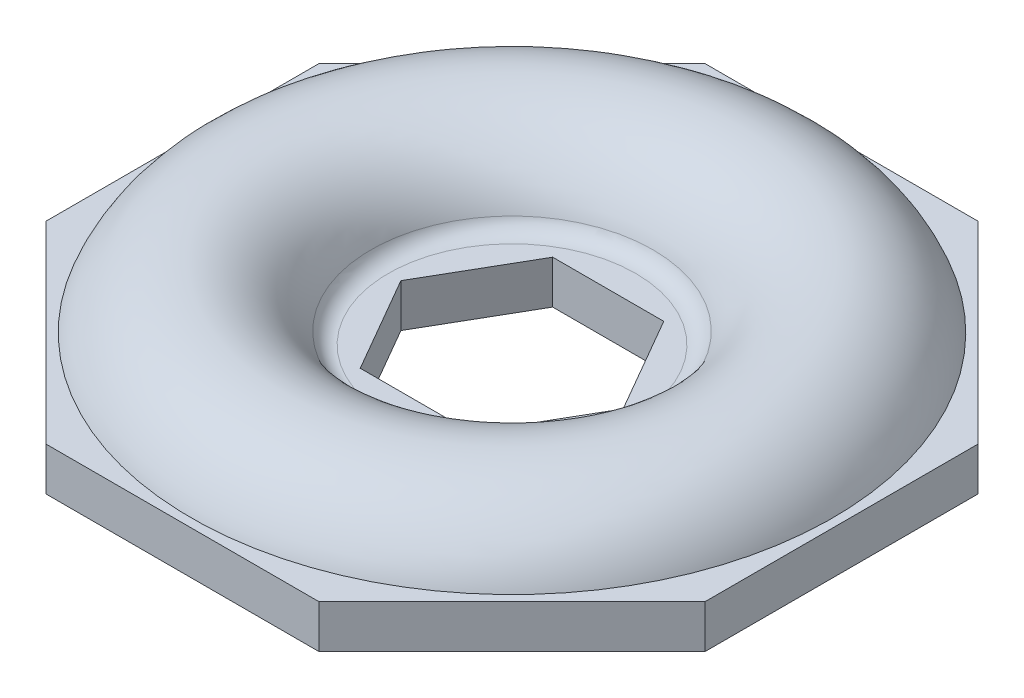
ISO-10303-21;
HEADER;
FILE_DESCRIPTION(('STEP AP214'),'2;1');
FILE_NAME('part.step','',(''),(''),'','','');
FILE_SCHEMA(('AUTOMOTIVE_DESIGN { 1 0 10303 214 1 1 1 1 }'));
ENDSEC;
DATA;
#1=APPLICATION_CONTEXT('core data for automotive mechanical design processes');
#2=APPLICATION_PROTOCOL_DEFINITION('international standard','automotive_design',2000,#1);
#3=PRODUCT_CONTEXT('',#1,'mechanical');
#4=PRODUCT('Part','Part','',(#3));
#5=PRODUCT_RELATED_PRODUCT_CATEGORY('part','',(#4));
#6=PRODUCT_DEFINITION_FORMATION('','',#4);
#7=PRODUCT_DEFINITION_CONTEXT('part definition',#1,'design');
#8=PRODUCT_DEFINITION('design','',#6,#7);
#9=PRODUCT_DEFINITION_SHAPE('','',#8);
#10=(LENGTH_UNIT() NAMED_UNIT(*) SI_UNIT(.MILLI.,.METRE.));
#11=(NAMED_UNIT(*) PLANE_ANGLE_UNIT() SI_UNIT($,.RADIAN.));
#12=(NAMED_UNIT(*) SI_UNIT($,.STERADIAN.) SOLID_ANGLE_UNIT());
#13=UNCERTAINTY_MEASURE_WITH_UNIT(LENGTH_MEASURE(1.E-05),#10,'distance_accuracy_value','');
#14=(GEOMETRIC_REPRESENTATION_CONTEXT(3) GLOBAL_UNCERTAINTY_ASSIGNED_CONTEXT((#13)) GLOBAL_UNIT_ASSIGNED_CONTEXT((#10,
#11,#12)) REPRESENTATION_CONTEXT('',''));
#15=CARTESIAN_POINT('',(0.,0.,0.));
#16=DIRECTION('',(0.,0.,1.));
#17=DIRECTION('',(1.,0.,0.));
#18=AXIS2_PLACEMENT_3D('',#15,#16,#17);
#19=CARTESIAN_POINT('',(-15.0178274382566,0.508000000000002,0.));
#20=DIRECTION('',(0.,1.,0.));
#21=DIRECTION('',(0.,0.,1.));
#22=AXIS2_PLACEMENT_3D('',#19,#20,#21);
#23=PLANE('',#22);
#24=CARTESIAN_POINT('',(0.,0.508000000000008,0.));
#25=DIRECTION('',(0.,-1.,0.));
#26=DIRECTION('',(0.,0.,-1.));
#27=AXIS2_PLACEMENT_3D('',#24,#25,#26);
#28=CIRCLE('',#27,15.0178274382566);
#29=CARTESIAN_POINT('',(0.,0.508000000000008,-15.0178274382566));
#30=VERTEX_POINT('',#29);
#31=EDGE_CURVE('E245',#30,#30,#28,.T.);
#32=ORIENTED_EDGE('',*,*,#31,.F.);
#33=EDGE_LOOP('',(#32));
#34=FACE_BOUND('',#33,.T.);
#35=DIRECTION('',(-1.,0.,0.));
#36=VECTOR('',#35,1.);
#37=CARTESIAN_POINT('',(-6.57564030267289,0.508000000000002,15.875));
#38=LINE('',#37,#36);
#39=CARTESIAN_POINT('',(6.57564030267288,0.508000000000002,15.875));
#40=VERTEX_POINT('',#39);
#41=CARTESIAN_POINT('',(-6.57564030267289,0.508000000000002,15.875));
#42=VERTEX_POINT('',#41);
#43=EDGE_CURVE('E189',#40,#42,#38,.T.);
#44=ORIENTED_EDGE('',*,*,#43,.T.);
#45=DIRECTION('',(-0.707106781186547,0.,-0.707106781186548));
#46=VECTOR('',#45,1.);
#47=CARTESIAN_POINT('',(-15.875,0.508000000000002,6.57564030267288));
#48=LINE('',#47,#46);
#49=CARTESIAN_POINT('',(-15.875,0.508000000000002,6.57564030267288));
#50=VERTEX_POINT('',#49);
#51=EDGE_CURVE('E186',#42,#50,#48,.T.);
#52=ORIENTED_EDGE('',*,*,#51,.T.);
#53=DIRECTION('',(0.,0.,-1.));
#54=VECTOR('',#53,1.);
#55=CARTESIAN_POINT('',(-15.875,0.508000000000002,-6.57564030267289));
#56=LINE('',#55,#54);
#57=CARTESIAN_POINT('',(-15.875,0.508000000000002,-6.57564030267289));
#58=VERTEX_POINT('',#57);
#59=EDGE_CURVE('E183',#50,#58,#56,.T.);
#60=ORIENTED_EDGE('',*,*,#59,.T.);
#61=DIRECTION('',(0.707106781186548,0.,-0.707106781186548));
#62=VECTOR('',#61,1.);
#63=CARTESIAN_POINT('',(-6.57564030267289,0.508000000000002,-15.875));
#64=LINE('',#63,#62);
#65=CARTESIAN_POINT('',(-6.57564030267289,0.508000000000002,-15.875));
#66=VERTEX_POINT('',#65);
#67=EDGE_CURVE('E180',#58,#66,#64,.T.);
#68=ORIENTED_EDGE('',*,*,#67,.T.);
#69=DIRECTION('',(1.,0.,0.));
#70=VECTOR('',#69,1.);
#71=CARTESIAN_POINT('',(6.57564030267287,0.508000000000002,-15.875));
#72=LINE('',#71,#70);
#73=CARTESIAN_POINT('',(6.57564030267287,0.508000000000002,-15.875));
#74=VERTEX_POINT('',#73);
#75=EDGE_CURVE('E177',#66,#74,#72,.T.);
#76=ORIENTED_EDGE('',*,*,#75,.T.);
#77=DIRECTION('',(0.707106781186548,0.,0.707106781186547));
#78=VECTOR('',#77,1.);
#79=CARTESIAN_POINT('',(15.875,0.508000000000002,-6.5756403026729));
#80=LINE('',#79,#78);
#81=CARTESIAN_POINT('',(15.875,0.508000000000002,-6.5756403026729));
#82=VERTEX_POINT('',#81);
#83=EDGE_CURVE('E174',#74,#82,#80,.T.);
#84=ORIENTED_EDGE('',*,*,#83,.T.);
#85=DIRECTION('',(0.,0.,1.));
#86=VECTOR('',#85,1.);
#87=CARTESIAN_POINT('',(15.875,0.508000000000002,6.57564030267288));
#88=LINE('',#87,#86);
#89=CARTESIAN_POINT('',(15.875,0.508000000000002,6.57564030267288));
#90=VERTEX_POINT('',#89);
#91=EDGE_CURVE('E171',#82,#90,#88,.T.);
#92=ORIENTED_EDGE('',*,*,#91,.T.);
#93=DIRECTION('',(-0.707106781186547,0.,0.707106781186548));
#94=VECTOR('',#93,1.);
#95=CARTESIAN_POINT('',(6.57564030267288,0.508000000000002,15.875));
#96=LINE('',#95,#94);
#97=EDGE_CURVE('E219',#90,#40,#96,.T.);
#98=ORIENTED_EDGE('',*,*,#97,.T.);
#99=EDGE_LOOP('',(#44,#52,#60,#68,#76,#84,#92,#98));
#100=FACE_BOUND('',#99,.T.);
#101=ADVANCED_FACE('F16',(#34,#100),#23,.F.);
#102=CARTESIAN_POINT('',(0.,0.,0.));
#103=DIRECTION('',(0.,1.,0.));
#104=DIRECTION('',(0.,0.,1.));
#105=AXIS2_PLACEMENT_3D('',#102,#103,#104);
#106=PLANE('',#105);
#107=DIRECTION('',(0.5,0.,0.866025403784439));
#108=VECTOR('',#107,1.);
#109=CARTESIAN_POINT('',(-4.01446075924276,0.,2.31775));
#110=LINE('',#109,#108);
#111=CARTESIAN_POINT('',(-5.35261434565702,0.,0.));
#112=VERTEX_POINT('',#111);
#113=CARTESIAN_POINT('',(-2.67630717282851,0.,4.6355));
#114=VERTEX_POINT('',#113);
#115=EDGE_CURVE('E165',#112,#114,#110,.T.);
#116=ORIENTED_EDGE('',*,*,#115,.T.);
#117=DIRECTION('',(1.,0.,0.));
#118=VECTOR('',#117,1.);
#119=CARTESIAN_POINT('',(0.,0.,4.6355));
#120=LINE('',#119,#118);
#121=CARTESIAN_POINT('',(2.67630717282851,0.,4.6355));
#122=VERTEX_POINT('',#121);
#123=EDGE_CURVE('E168',#114,#122,#120,.T.);
#124=ORIENTED_EDGE('',*,*,#123,.T.);
#125=DIRECTION('',(0.5,0.,-0.866025403784439));
#126=VECTOR('',#125,1.);
#127=CARTESIAN_POINT('',(4.01446075924276,0.,2.31775));
#128=LINE('',#127,#126);
#129=CARTESIAN_POINT('',(5.35261434565702,0.,0.));
#130=VERTEX_POINT('',#129);
#131=EDGE_CURVE('E150',#122,#130,#128,.T.);
#132=ORIENTED_EDGE('',*,*,#131,.T.);
#133=DIRECTION('',(-0.5,0.,-0.866025403784438));
#134=VECTOR('',#133,1.);
#135=CARTESIAN_POINT('',(4.01446075924276,0.,-2.31775));
#136=LINE('',#135,#134);
#137=CARTESIAN_POINT('',(2.67630717282851,0.,-4.6355));
#138=VERTEX_POINT('',#137);
#139=EDGE_CURVE('E123',#130,#138,#136,.T.);
#140=ORIENTED_EDGE('',*,*,#139,.T.);
#141=DIRECTION('',(-1.,0.,0.));
#142=VECTOR('',#141,1.);
#143=CARTESIAN_POINT('',(0.,0.,-4.6355));
#144=LINE('',#143,#142);
#145=CARTESIAN_POINT('',(-2.67630717282851,0.,-4.6355));
#146=VERTEX_POINT('',#145);
#147=EDGE_CURVE('E159',#138,#146,#144,.T.);
#148=ORIENTED_EDGE('',*,*,#147,.T.);
#149=DIRECTION('',(-0.5,0.,0.866025403784439));
#150=VECTOR('',#149,1.);
#151=CARTESIAN_POINT('',(-4.01446075924277,0.,-2.31775));
#152=LINE('',#151,#150);
#153=EDGE_CURVE('E162',#146,#112,#152,.T.);
#154=ORIENTED_EDGE('',*,*,#153,.T.);
#155=EDGE_LOOP('',(#116,#124,#132,#140,#148,#154));
#156=FACE_BOUND('',#155,.T.);
#157=CARTESIAN_POINT('',(0.,0.,0.));
#158=DIRECTION('',(0.,-1.,0.));
#159=DIRECTION('',(0.,0.,-1.));
#160=AXIS2_PLACEMENT_3D('',#157,#158,#159);
#161=CIRCLE('',#160,5.95936642905503);
#162=CARTESIAN_POINT('',(0.,0.,-5.95936642905503));
#163=VERTEX_POINT('',#162);
#164=EDGE_CURVE('E11',#163,#163,#161,.T.);
#165=ORIENTED_EDGE('',*,*,#164,.T.);
#166=EDGE_LOOP('',(#165));
#167=FACE_BOUND('',#166,.T.);
#168=ADVANCED_FACE('F18',(#156,#167),#106,.F.);
#169=CARTESIAN_POINT('',(0.,2.9718,0.));
#170=DIRECTION('',(0.,-1.,0.));
#171=DIRECTION('',(0.,0.,-1.));
#172=AXIS2_PLACEMENT_3D('',#169,#170,#171);
#173=TOROIDAL_SURFACE('',#172,5.95936642905503,2.9718);
#174=ORIENTED_EDGE('',*,*,#164,.F.);
#175=EDGE_LOOP('',(#174));
#176=FACE_BOUND('',#175,.T.);
#177=CARTESIAN_POINT('',(0.,1.91729032258064,0.));
#178=DIRECTION('',(0.,-1.,0.));
#179=DIRECTION('',(0.,0.,-1.));
#180=AXIS2_PLACEMENT_3D('',#177,#178,#179);
#181=CIRCLE('',#180,8.73778406868896);
#182=CARTESIAN_POINT('',(0.,1.91729032258064,-8.73778406868896));
#183=VERTEX_POINT('',#182);
#184=EDGE_CURVE('E24',#183,#183,#181,.T.);
#185=ORIENTED_EDGE('',*,*,#184,.T.);
#186=EDGE_LOOP('',(#185));
#187=FACE_BOUND('',#186,.T.);
#188=ADVANCED_FACE('F253',(#176,#187),#173,.T.);
#189=CARTESIAN_POINT('',(0.,1.016,0.));
#190=DIRECTION('',(0.,-1.,0.));
#191=DIRECTION('',(0.,0.,-1.));
#192=AXIS2_PLACEMENT_3D('',#189,#190,#191);
#193=TOROIDAL_SURFACE('',#192,11.1125,2.54);
#194=ORIENTED_EDGE('',*,*,#184,.F.);
#195=EDGE_LOOP('',(#194));
#196=FACE_BOUND('',#195,.T.);
#197=CARTESIAN_POINT('',(0.,1.63297160883281,0.));
#198=DIRECTION('',(0.,-1.,0.));
#199=DIRECTION('',(0.,0.,-1.));
#200=AXIS2_PLACEMENT_3D('',#197,#198,#199);
#201=CIRCLE('',#200,13.5764289831272);
#202=CARTESIAN_POINT('',(0.,1.63297160883281,-13.5764289831272));
#203=VERTEX_POINT('',#202);
#204=EDGE_CURVE('E248',#203,#203,#201,.T.);
#205=ORIENTED_EDGE('',*,*,#204,.T.);
#206=EDGE_LOOP('',(#205));
#207=FACE_BOUND('',#206,.T.);
#208=ADVANCED_FACE('F255',(#196,#207),#193,.F.);
#209=CARTESIAN_POINT('',(0.,1.9939,0.));
#210=DIRECTION('',(0.,-1.,0.));
#211=DIRECTION('',(0.,0.,-1.));
#212=AXIS2_PLACEMENT_3D('',#209,#210,#211);
#213=TOROIDAL_SURFACE('',#212,15.0178274382566,1.4859);
#214=ORIENTED_EDGE('',*,*,#204,.F.);
#215=EDGE_LOOP('',(#214));
#216=FACE_BOUND('',#215,.T.);
#217=ORIENTED_EDGE('',*,*,#31,.T.);
#218=EDGE_LOOP('',(#217));
#219=FACE_BOUND('',#218,.T.);
#220=ADVANCED_FACE('F258',(#216,#219),#213,.T.);
#221=CARTESIAN_POINT('',(-6.57564030267289,-0.001000000000001,15.875));
#222=DIRECTION('',(0.,0.,1.));
#223=DIRECTION('',(1.,0.,0.));
#224=AXIS2_PLACEMENT_3D('',#221,#222,#223);
#225=PLANE('',#224);
#226=DIRECTION('',(0.,1.,0.));
#227=VECTOR('',#226,1.);
#228=CARTESIAN_POINT('',(6.57564030267288,-0.001000000000001,15.875));
#229=LINE('',#228,#227);
#230=CARTESIAN_POINT('',(6.57564030267288,2.5908,15.875));
#231=VERTEX_POINT('',#230);
#232=EDGE_CURVE('E216',#40,#231,#229,.T.);
#233=ORIENTED_EDGE('',*,*,#232,.T.);
#234=DIRECTION('',(1.,0.,0.));
#235=VECTOR('',#234,1.);
#236=CARTESIAN_POINT('',(-6.57564030267289,2.5908,15.875));
#237=LINE('',#236,#235);
#238=CARTESIAN_POINT('',(-6.57564030267289,2.5908,15.875));
#239=VERTEX_POINT('',#238);
#240=EDGE_CURVE('E192',#239,#231,#237,.T.);
#241=ORIENTED_EDGE('',*,*,#240,.F.);
#242=DIRECTION('',(0.,1.,0.));
#243=VECTOR('',#242,1.);
#244=CARTESIAN_POINT('',(-6.57564030267289,-0.001000000000001,15.875));
#245=LINE('',#244,#243);
#246=EDGE_CURVE('E217',#42,#239,#245,.T.);
#247=ORIENTED_EDGE('',*,*,#246,.F.);
#248=ORIENTED_EDGE('',*,*,#43,.F.);
#249=EDGE_LOOP('',(#233,#241,#247,#248));
#250=FACE_BOUND('',#249,.T.);
#251=ADVANCED_FACE('F264',(#250),#225,.T.);
#252=CARTESIAN_POINT('',(-15.875,-0.001000000000001,6.57564030267288));
#253=DIRECTION('',(-0.707106781186548,0.,0.707106781186547));
#254=DIRECTION('',(0.707106781186547,0.,0.707106781186548));
#255=AXIS2_PLACEMENT_3D('',#252,#253,#254);
#256=PLANE('',#255);
#257=ORIENTED_EDGE('',*,*,#246,.T.);
#258=DIRECTION('',(0.707106781186547,0.,0.707106781186548));
#259=VECTOR('',#258,1.);
#260=CARTESIAN_POINT('',(-15.875,2.5908,6.57564030267288));
#261=LINE('',#260,#259);
#262=CARTESIAN_POINT('',(-15.875,2.5908,6.57564030267288));
#263=VERTEX_POINT('',#262);
#264=EDGE_CURVE('E213',#263,#239,#261,.T.);
#265=ORIENTED_EDGE('',*,*,#264,.F.);
#266=DIRECTION('',(0.,1.,0.));
#267=VECTOR('',#266,1.);
#268=CARTESIAN_POINT('',(-15.875,-0.001000000000001,6.57564030267288));
#269=LINE('',#268,#267);
#270=EDGE_CURVE('E220',#50,#263,#269,.T.);
#271=ORIENTED_EDGE('',*,*,#270,.F.);
#272=ORIENTED_EDGE('',*,*,#51,.F.);
#273=EDGE_LOOP('',(#257,#265,#271,#272));
#274=FACE_BOUND('',#273,.T.);
#275=ADVANCED_FACE('F278',(#274),#256,.T.);
#276=CARTESIAN_POINT('',(-15.875,-0.001000000000001,-6.57564030267289));
#277=DIRECTION('',(-1.,0.,0.));
#278=DIRECTION('',(0.,0.,1.));
#279=AXIS2_PLACEMENT_3D('',#276,#277,#278);
#280=PLANE('',#279);
#281=ORIENTED_EDGE('',*,*,#270,.T.);
#282=DIRECTION('',(0.,0.,1.));
#283=VECTOR('',#282,1.);
#284=CARTESIAN_POINT('',(-15.875,2.5908,-6.57564030267289));
#285=LINE('',#284,#283);
#286=CARTESIAN_POINT('',(-15.875,2.5908,-6.57564030267289));
#287=VERTEX_POINT('',#286);
#288=EDGE_CURVE('E210',#287,#263,#285,.T.);
#289=ORIENTED_EDGE('',*,*,#288,.F.);
#290=DIRECTION('',(0.,1.,0.));
#291=VECTOR('',#290,1.);
#292=CARTESIAN_POINT('',(-15.875,-0.001000000000001,-6.57564030267289));
#293=LINE('',#292,#291);
#294=EDGE_CURVE('E222',#58,#287,#293,.T.);
#295=ORIENTED_EDGE('',*,*,#294,.F.);
#296=ORIENTED_EDGE('',*,*,#59,.F.);
#297=EDGE_LOOP('',(#281,#289,#295,#296));
#298=FACE_BOUND('',#297,.T.);
#299=ADVANCED_FACE('F282',(#298),#280,.T.);
#300=CARTESIAN_POINT('',(-6.57564030267289,-0.001000000000001,-15.875));
#301=DIRECTION('',(-0.707106781186548,0.,-0.707106781186548));
#302=DIRECTION('',(-0.707106781186548,0.,0.707106781186548));
#303=AXIS2_PLACEMENT_3D('',#300,#301,#302);
#304=PLANE('',#303);
#305=ORIENTED_EDGE('',*,*,#294,.T.);
#306=DIRECTION('',(-0.707106781186548,0.,0.707106781186548));
#307=VECTOR('',#306,1.);
#308=CARTESIAN_POINT('',(-6.57564030267289,2.5908,-15.875));
#309=LINE('',#308,#307);
#310=CARTESIAN_POINT('',(-6.57564030267289,2.5908,-15.875));
#311=VERTEX_POINT('',#310);
#312=EDGE_CURVE('E207',#311,#287,#309,.T.);
#313=ORIENTED_EDGE('',*,*,#312,.F.);
#314=DIRECTION('',(0.,1.,0.));
#315=VECTOR('',#314,1.);
#316=CARTESIAN_POINT('',(-6.57564030267289,-0.001000000000001,-15.875));
#317=LINE('',#316,#315);
#318=EDGE_CURVE('E224',#66,#311,#317,.T.);
#319=ORIENTED_EDGE('',*,*,#318,.F.);
#320=ORIENTED_EDGE('',*,*,#67,.F.);
#321=EDGE_LOOP('',(#305,#313,#319,#320));
#322=FACE_BOUND('',#321,.T.);
#323=ADVANCED_FACE('F286',(#322),#304,.T.);
#324=CARTESIAN_POINT('',(6.57564030267287,-0.001000000000001,-15.875));
#325=DIRECTION('',(0.,0.,-1.));
#326=DIRECTION('',(-1.,0.,0.));
#327=AXIS2_PLACEMENT_3D('',#324,#325,#326);
#328=PLANE('',#327);
#329=ORIENTED_EDGE('',*,*,#318,.T.);
#330=DIRECTION('',(-1.,0.,0.));
#331=VECTOR('',#330,1.);
#332=CARTESIAN_POINT('',(6.57564030267287,2.5908,-15.875));
#333=LINE('',#332,#331);
#334=CARTESIAN_POINT('',(6.57564030267287,2.5908,-15.875));
#335=VERTEX_POINT('',#334);
#336=EDGE_CURVE('E204',#335,#311,#333,.T.);
#337=ORIENTED_EDGE('',*,*,#336,.F.);
#338=DIRECTION('',(0.,1.,0.));
#339=VECTOR('',#338,1.);
#340=CARTESIAN_POINT('',(6.57564030267287,-0.001000000000001,-15.875));
#341=LINE('',#340,#339);
#342=EDGE_CURVE('E226',#74,#335,#341,.T.);
#343=ORIENTED_EDGE('',*,*,#342,.F.);
#344=ORIENTED_EDGE('',*,*,#75,.F.);
#345=EDGE_LOOP('',(#329,#337,#343,#344));
#346=FACE_BOUND('',#345,.T.);
#347=ADVANCED_FACE('F290',(#346),#328,.T.);
#348=CARTESIAN_POINT('',(15.875,-0.001000000000001,-6.5756403026729));
#349=DIRECTION('',(0.707106781186547,0.,-0.707106781186548));
#350=DIRECTION('',(-0.707106781186548,0.,-0.707106781186547));
#351=AXIS2_PLACEMENT_3D('',#348,#349,#350);
#352=PLANE('',#351);
#353=ORIENTED_EDGE('',*,*,#342,.T.);
#354=DIRECTION('',(-0.707106781186548,0.,-0.707106781186547));
#355=VECTOR('',#354,1.);
#356=CARTESIAN_POINT('',(15.875,2.5908,-6.5756403026729));
#357=LINE('',#356,#355);
#358=CARTESIAN_POINT('',(15.875,2.5908,-6.5756403026729));
#359=VERTEX_POINT('',#358);
#360=EDGE_CURVE('E201',#359,#335,#357,.T.);
#361=ORIENTED_EDGE('',*,*,#360,.F.);
#362=DIRECTION('',(0.,1.,0.));
#363=VECTOR('',#362,1.);
#364=CARTESIAN_POINT('',(15.875,-0.001000000000001,-6.5756403026729));
#365=LINE('',#364,#363);
#366=EDGE_CURVE('E228',#82,#359,#365,.T.);
#367=ORIENTED_EDGE('',*,*,#366,.F.);
#368=ORIENTED_EDGE('',*,*,#83,.F.);
#369=EDGE_LOOP('',(#353,#361,#367,#368));
#370=FACE_BOUND('',#369,.T.);
#371=ADVANCED_FACE('F294',(#370),#352,.T.);
#372=CARTESIAN_POINT('',(15.875,-0.001000000000001,6.57564030267288));
#373=DIRECTION('',(1.,0.,0.));
#374=DIRECTION('',(0.,0.,-1.));
#375=AXIS2_PLACEMENT_3D('',#372,#373,#374);
#376=PLANE('',#375);
#377=ORIENTED_EDGE('',*,*,#366,.T.);
#378=DIRECTION('',(0.,0.,-1.));
#379=VECTOR('',#378,1.);
#380=CARTESIAN_POINT('',(15.875,2.5908,6.57564030267288));
#381=LINE('',#380,#379);
#382=CARTESIAN_POINT('',(15.875,2.5908,6.57564030267288));
#383=VERTEX_POINT('',#382);
#384=EDGE_CURVE('E198',#383,#359,#381,.T.);
#385=ORIENTED_EDGE('',*,*,#384,.F.);
#386=DIRECTION('',(0.,1.,0.));
#387=VECTOR('',#386,1.);
#388=CARTESIAN_POINT('',(15.875,-0.001000000000001,6.57564030267288));
#389=LINE('',#388,#387);
#390=EDGE_CURVE('E230',#90,#383,#389,.T.);
#391=ORIENTED_EDGE('',*,*,#390,.F.);
#392=ORIENTED_EDGE('',*,*,#91,.F.);
#393=EDGE_LOOP('',(#377,#385,#391,#392));
#394=FACE_BOUND('',#393,.T.);
#395=ADVANCED_FACE('F298',(#394),#376,.T.);
#396=CARTESIAN_POINT('',(6.57564030267288,-0.001000000000001,15.875));
#397=DIRECTION('',(0.707106781186548,0.,0.707106781186547));
#398=DIRECTION('',(0.707106781186547,0.,-0.707106781186548));
#399=AXIS2_PLACEMENT_3D('',#396,#397,#398);
#400=PLANE('',#399);
#401=ORIENTED_EDGE('',*,*,#390,.T.);
#402=DIRECTION('',(0.707106781186547,0.,-0.707106781186548));
#403=VECTOR('',#402,1.);
#404=CARTESIAN_POINT('',(6.57564030267288,2.5908,15.875));
#405=LINE('',#404,#403);
#406=EDGE_CURVE('E195',#231,#383,#405,.T.);
#407=ORIENTED_EDGE('',*,*,#406,.F.);
#408=ORIENTED_EDGE('',*,*,#232,.F.);
#409=ORIENTED_EDGE('',*,*,#97,.F.);
#410=EDGE_LOOP('',(#401,#407,#408,#409));
#411=FACE_BOUND('',#410,.T.);
#412=ADVANCED_FACE('F300',(#411),#400,.T.);
#413=CARTESIAN_POINT('',(0.,2.0828,0.));
#414=DIRECTION('',(0.,-1.,0.));
#415=DIRECTION('',(0.,0.,-1.));
#416=AXIS2_PLACEMENT_3D('',#413,#414,#415);
#417=PLANE('',#416);
#418=DIRECTION('',(0.5,0.,-0.866025403784439));
#419=VECTOR('',#418,1.);
#420=CARTESIAN_POINT('',(2.67630717282851,2.0828,4.6355));
#421=LINE('',#420,#419);
#422=CARTESIAN_POINT('',(2.67630717282851,2.0828,4.6355));
#423=VERTEX_POINT('',#422);
#424=CARTESIAN_POINT('',(5.35261434565702,2.0828,0.));
#425=VERTEX_POINT('',#424);
#426=EDGE_CURVE('E129',#423,#425,#421,.T.);
#427=ORIENTED_EDGE('',*,*,#426,.F.);
#428=DIRECTION('',(1.,0.,0.));
#429=VECTOR('',#428,1.);
#430=CARTESIAN_POINT('',(-2.67630717282851,2.0828,4.6355));
#431=LINE('',#430,#429);
#432=CARTESIAN_POINT('',(-2.67630717282851,2.0828,4.6355));
#433=VERTEX_POINT('',#432);
#434=EDGE_CURVE('E39',#433,#423,#431,.T.);
#435=ORIENTED_EDGE('',*,*,#434,.F.);
#436=DIRECTION('',(0.5,0.,0.866025403784438));
#437=VECTOR('',#436,1.);
#438=CARTESIAN_POINT('',(-5.35261434565702,2.0828,0.));
#439=LINE('',#438,#437);
#440=CARTESIAN_POINT('',(-5.35261434565702,2.0828,0.));
#441=VERTEX_POINT('',#440);
#442=EDGE_CURVE('E145',#441,#433,#439,.T.);
#443=ORIENTED_EDGE('',*,*,#442,.F.);
#444=DIRECTION('',(-0.5,0.,0.866025403784439));
#445=VECTOR('',#444,1.);
#446=CARTESIAN_POINT('',(-2.67630717282851,2.0828,-4.6355));
#447=LINE('',#446,#445);
#448=CARTESIAN_POINT('',(-2.67630717282851,2.0828,-4.6355));
#449=VERTEX_POINT('',#448);
#450=EDGE_CURVE('E139',#449,#441,#447,.T.);
#451=ORIENTED_EDGE('',*,*,#450,.F.);
#452=DIRECTION('',(-1.,0.,0.));
#453=VECTOR('',#452,1.);
#454=CARTESIAN_POINT('',(2.67630717282851,2.0828,-4.6355));
#455=LINE('',#454,#453);
#456=CARTESIAN_POINT('',(2.67630717282851,2.0828,-4.6355));
#457=VERTEX_POINT('',#456);
#458=EDGE_CURVE('E137',#457,#449,#455,.T.);
#459=ORIENTED_EDGE('',*,*,#458,.F.);
#460=DIRECTION('',(-0.5,0.,-0.866025403784438));
#461=VECTOR('',#460,1.);
#462=CARTESIAN_POINT('',(5.35261434565702,2.0828,0.));
#463=LINE('',#462,#461);
#464=EDGE_CURVE('E120',#425,#457,#463,.T.);
#465=ORIENTED_EDGE('',*,*,#464,.F.);
#466=EDGE_LOOP('',(#427,#435,#443,#451,#459,#465));
#467=FACE_BOUND('',#466,.T.);
#468=CARTESIAN_POINT('',(0.,2.0828,0.));
#469=DIRECTION('',(0.,-1.,0.));
#470=DIRECTION('',(0.,0.,-1.));
#471=AXIS2_PLACEMENT_3D('',#468,#469,#470);
#472=CIRCLE('',#471,5.95936642905503);
#473=CARTESIAN_POINT('',(0.,2.0828,-5.95936642905503));
#474=VERTEX_POINT('',#473);
#475=EDGE_CURVE('E236',#474,#474,#472,.T.);
#476=ORIENTED_EDGE('',*,*,#475,.F.);
#477=EDGE_LOOP('',(#476));
#478=FACE_BOUND('',#477,.T.);
#479=ADVANCED_FACE('F133',(#467,#478),#417,.F.);
#480=CARTESIAN_POINT('',(0.,2.9718,0.));
#481=DIRECTION('',(0.,-1.,0.));
#482=DIRECTION('',(0.,0.,-1.));
#483=AXIS2_PLACEMENT_3D('',#480,#481,#482);
#484=TOROIDAL_SURFACE('',#483,5.95936642905503,0.889);
#485=CARTESIAN_POINT('',(0.,2.65634838709677,0.));
#486=DIRECTION('',(0.,-1.,0.));
#487=DIRECTION('',(0.,0.,-1.));
#488=AXIS2_PLACEMENT_3D('',#485,#486,#487);
#489=CIRCLE('',#488,6.7905170050139);
#490=CARTESIAN_POINT('',(0.,2.65634838709677,-6.7905170050139));
#491=VERTEX_POINT('',#490);
#492=EDGE_CURVE('E239',#491,#491,#489,.T.);
#493=ORIENTED_EDGE('',*,*,#492,.F.);
#494=EDGE_LOOP('',(#493));
#495=FACE_BOUND('',#494,.T.);
#496=ORIENTED_EDGE('',*,*,#475,.T.);
#497=EDGE_LOOP('',(#496));
#498=FACE_BOUND('',#497,.T.);
#499=ADVANCED_FACE('F316',(#495,#498),#484,.F.);
#500=CARTESIAN_POINT('',(0.,1.016,0.));
#501=DIRECTION('',(0.,-1.,0.));
#502=DIRECTION('',(0.,0.,-1.));
#503=AXIS2_PLACEMENT_3D('',#500,#501,#502);
#504=TOROIDAL_SURFACE('',#503,11.1125,4.6228);
#505=CARTESIAN_POINT('',(0.,2.5908,0.));
#506=DIRECTION('',(0.,-1.,0.));
#507=DIRECTION('',(0.,0.,-1.));
#508=AXIS2_PLACEMENT_3D('',#505,#506,#507);
#509=CIRCLE('',#508,15.4587955260774);
#510=CARTESIAN_POINT('',(0.,2.5908,-15.4587955260774));
#511=VERTEX_POINT('',#510);
#512=EDGE_CURVE('E242',#511,#511,#509,.T.);
#513=ORIENTED_EDGE('',*,*,#512,.F.);
#514=EDGE_LOOP('',(#513));
#515=FACE_BOUND('',#514,.T.);
#516=ORIENTED_EDGE('',*,*,#492,.T.);
#517=EDGE_LOOP('',(#516));
#518=FACE_BOUND('',#517,.T.);
#519=ADVANCED_FACE('F305',(#515,#518),#504,.T.);
#520=CARTESIAN_POINT('',(-15.4587955260774,2.5908,0.));
#521=DIRECTION('',(0.,-1.,0.));
#522=DIRECTION('',(0.,0.,-1.));
#523=AXIS2_PLACEMENT_3D('',#520,#521,#522);
#524=PLANE('',#523);
#525=ORIENTED_EDGE('',*,*,#512,.T.);
#526=EDGE_LOOP('',(#525));
#527=FACE_BOUND('',#526,.T.);
#528=ORIENTED_EDGE('',*,*,#240,.T.);
#529=ORIENTED_EDGE('',*,*,#406,.T.);
#530=ORIENTED_EDGE('',*,*,#384,.T.);
#531=ORIENTED_EDGE('',*,*,#360,.T.);
#532=ORIENTED_EDGE('',*,*,#336,.T.);
#533=ORIENTED_EDGE('',*,*,#312,.T.);
#534=ORIENTED_EDGE('',*,*,#288,.T.);
#535=ORIENTED_EDGE('',*,*,#264,.T.);
#536=EDGE_LOOP('',(#528,#529,#530,#531,#532,#533,#534,#535));
#537=FACE_BOUND('',#536,.T.);
#538=ADVANCED_FACE('F302',(#527,#537),#524,.F.);
#539=CARTESIAN_POINT('',(-2.67630717282851,-0.4572,4.6355));
#540=DIRECTION('',(0.,0.,1.));
#541=DIRECTION('',(1.,0.,0.));
#542=AXIS2_PLACEMENT_3D('',#539,#540,#541);
#543=PLANE('',#542);
#544=DIRECTION('',(0.,1.,0.));
#545=VECTOR('',#544,1.);
#546=CARTESIAN_POINT('',(-2.67630717282851,-0.4572,4.6355));
#547=LINE('',#546,#545);
#548=EDGE_CURVE('E148',#114,#433,#547,.T.);
#549=ORIENTED_EDGE('',*,*,#548,.T.);
#550=ORIENTED_EDGE('',*,*,#434,.T.);
#551=DIRECTION('',(0.,1.,0.));
#552=VECTOR('',#551,1.);
#553=CARTESIAN_POINT('',(2.67630717282851,-0.4572,4.6355));
#554=LINE('',#553,#552);
#555=EDGE_CURVE('E126',#122,#423,#554,.T.);
#556=ORIENTED_EDGE('',*,*,#555,.F.);
#557=ORIENTED_EDGE('',*,*,#123,.F.);
#558=EDGE_LOOP('',(#549,#550,#556,#557));
#559=FACE_BOUND('',#558,.T.);
#560=ADVANCED_FACE('F304',(#559),#543,.F.);
#561=CARTESIAN_POINT('',(-5.35261434565702,-0.4572,0.));
#562=DIRECTION('',(-0.866025403784438,0.,0.5));
#563=DIRECTION('',(0.5,0.,0.866025403784439));
#564=AXIS2_PLACEMENT_3D('',#561,#562,#563);
#565=PLANE('',#564);
#566=DIRECTION('',(0.,1.,0.));
#567=VECTOR('',#566,1.);
#568=CARTESIAN_POINT('',(-5.35261434565702,-0.4572,0.));
#569=LINE('',#568,#567);
#570=EDGE_CURVE('E151',#112,#441,#569,.T.);
#571=ORIENTED_EDGE('',*,*,#570,.T.);
#572=ORIENTED_EDGE('',*,*,#442,.T.);
#573=ORIENTED_EDGE('',*,*,#548,.F.);
#574=ORIENTED_EDGE('',*,*,#115,.F.);
#575=EDGE_LOOP('',(#571,#572,#573,#574));
#576=FACE_BOUND('',#575,.T.);
#577=ADVANCED_FACE('F314',(#576),#565,.F.);
#578=CARTESIAN_POINT('',(-2.67630717282851,-0.4572,-4.6355));
#579=DIRECTION('',(-0.866025403784438,0.,-0.5));
#580=DIRECTION('',(-0.5,0.,0.866025403784439));
#581=AXIS2_PLACEMENT_3D('',#578,#579,#580);
#582=PLANE('',#581);
#583=DIRECTION('',(0.,1.,0.));
#584=VECTOR('',#583,1.);
#585=CARTESIAN_POINT('',(-2.67630717282851,-0.4572,-4.6355));
#586=LINE('',#585,#584);
#587=EDGE_CURVE('E153',#146,#449,#586,.T.);
#588=ORIENTED_EDGE('',*,*,#587,.T.);
#589=ORIENTED_EDGE('',*,*,#450,.T.);
#590=ORIENTED_EDGE('',*,*,#570,.F.);
#591=ORIENTED_EDGE('',*,*,#153,.F.);
#592=EDGE_LOOP('',(#588,#589,#590,#591));
#593=FACE_BOUND('',#592,.T.);
#594=ADVANCED_FACE('F336',(#593),#582,.F.);
#595=CARTESIAN_POINT('',(2.67630717282851,-0.4572,-4.6355));
#596=DIRECTION('',(0.,0.,-1.));
#597=DIRECTION('',(-1.,0.,0.));
#598=AXIS2_PLACEMENT_3D('',#595,#596,#597);
#599=PLANE('',#598);
#600=DIRECTION('',(0.,1.,0.));
#601=VECTOR('',#600,1.);
#602=CARTESIAN_POINT('',(2.67630717282851,-0.4572,-4.6355));
#603=LINE('',#602,#601);
#604=EDGE_CURVE('E125',#138,#457,#603,.T.);
#605=ORIENTED_EDGE('',*,*,#604,.T.);
#606=ORIENTED_EDGE('',*,*,#458,.T.);
#607=ORIENTED_EDGE('',*,*,#587,.F.);
#608=ORIENTED_EDGE('',*,*,#147,.F.);
#609=EDGE_LOOP('',(#605,#606,#607,#608));
#610=FACE_BOUND('',#609,.T.);
#611=ADVANCED_FACE('F340',(#610),#599,.F.);
#612=CARTESIAN_POINT('',(5.35261434565702,-0.4572,0.));
#613=DIRECTION('',(0.866025403784438,0.,-0.5));
#614=DIRECTION('',(-0.5,0.,-0.866025403784438));
#615=AXIS2_PLACEMENT_3D('',#612,#613,#614);
#616=PLANE('',#615);
#617=DIRECTION('',(0.,1.,0.));
#618=VECTOR('',#617,1.);
#619=CARTESIAN_POINT('',(5.35261434565702,-0.4572,0.));
#620=LINE('',#619,#618);
#621=EDGE_CURVE('E31',#130,#425,#620,.T.);
#622=ORIENTED_EDGE('',*,*,#621,.T.);
#623=ORIENTED_EDGE('',*,*,#464,.T.);
#624=ORIENTED_EDGE('',*,*,#604,.F.);
#625=ORIENTED_EDGE('',*,*,#139,.F.);
#626=EDGE_LOOP('',(#622,#623,#624,#625));
#627=FACE_BOUND('',#626,.T.);
#628=ADVANCED_FACE('F117',(#627),#616,.F.);
#629=CARTESIAN_POINT('',(2.67630717282851,-0.4572,4.6355));
#630=DIRECTION('',(0.866025403784439,0.,0.5));
#631=DIRECTION('',(0.5,0.,-0.866025403784439));
#632=AXIS2_PLACEMENT_3D('',#629,#630,#631);
#633=PLANE('',#632);
#634=ORIENTED_EDGE('',*,*,#555,.T.);
#635=ORIENTED_EDGE('',*,*,#426,.T.);
#636=ORIENTED_EDGE('',*,*,#621,.F.);
#637=ORIENTED_EDGE('',*,*,#131,.F.);
#638=EDGE_LOOP('',(#634,#635,#636,#637));
#639=FACE_BOUND('',#638,.T.);
#640=ADVANCED_FACE('F130',(#639),#633,.F.);
#641=CLOSED_SHELL('',(#101,#168,#188,#208,#220,#251,#275,#299,#323,#347,#371,#395,#412,#479,
#499,#519,#538,#560,#577,#594,#611,#628,#640));
#642=MANIFOLD_SOLID_BREP('B1',#641);
#643=ADVANCED_BREP_SHAPE_REPRESENTATION('',(#18,#642),#14);
#644=SHAPE_DEFINITION_REPRESENTATION(#9,#643);
ENDSEC;
END-ISO-10303-21;
